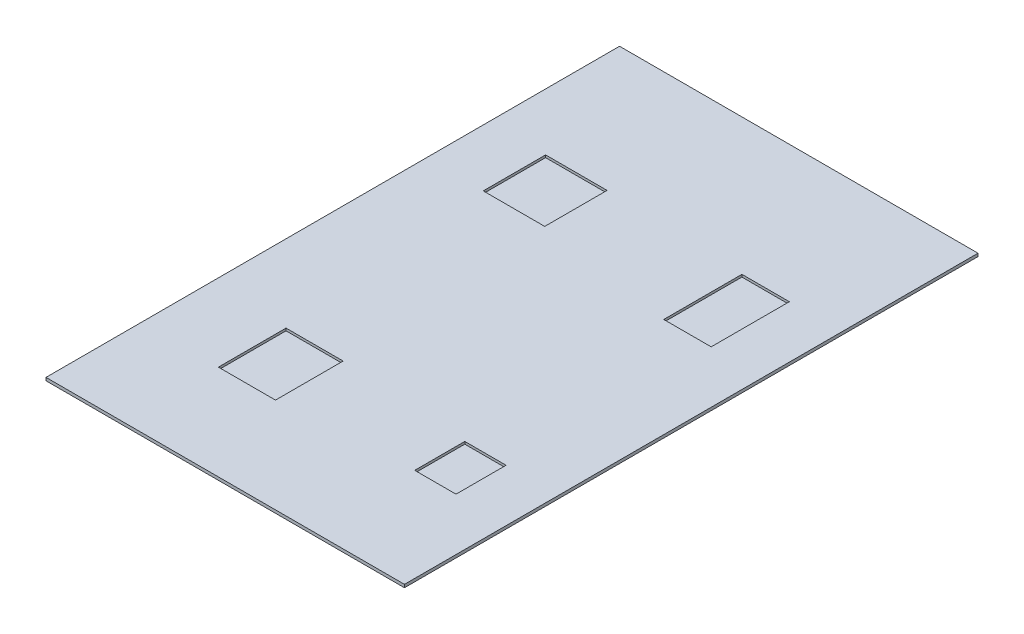
ISO-10303-21;
HEADER;
FILE_DESCRIPTION(('STEP AP214'),'2;1');
FILE_NAME('part.step','',(''),(''),'','','');
FILE_SCHEMA(('AUTOMOTIVE_DESIGN { 1 0 10303 214 1 1 1 1 }'));
ENDSEC;
DATA;
#1=APPLICATION_CONTEXT('core data for automotive mechanical design processes');
#2=APPLICATION_PROTOCOL_DEFINITION('international standard','automotive_design',2000,#1);
#3=PRODUCT_CONTEXT('',#1,'mechanical');
#4=PRODUCT('Part','Part','',(#3));
#5=PRODUCT_RELATED_PRODUCT_CATEGORY('part','',(#4));
#6=PRODUCT_DEFINITION_FORMATION('','',#4);
#7=PRODUCT_DEFINITION_CONTEXT('part definition',#1,'design');
#8=PRODUCT_DEFINITION('design','',#6,#7);
#9=PRODUCT_DEFINITION_SHAPE('','',#8);
#10=(LENGTH_UNIT() NAMED_UNIT(*) SI_UNIT(.MILLI.,.METRE.));
#11=(NAMED_UNIT(*) PLANE_ANGLE_UNIT() SI_UNIT($,.RADIAN.));
#12=(NAMED_UNIT(*) SI_UNIT($,.STERADIAN.) SOLID_ANGLE_UNIT());
#13=UNCERTAINTY_MEASURE_WITH_UNIT(LENGTH_MEASURE(1.E-05),#10,'distance_accuracy_value','');
#14=(GEOMETRIC_REPRESENTATION_CONTEXT(3) GLOBAL_UNCERTAINTY_ASSIGNED_CONTEXT((#13)) GLOBAL_UNIT_ASSIGNED_CONTEXT((#10,
#11,#12)) REPRESENTATION_CONTEXT('',''));
#15=CARTESIAN_POINT('',(0.,0.,0.));
#16=DIRECTION('',(0.,0.,1.));
#17=DIRECTION('',(1.,0.,0.));
#18=AXIS2_PLACEMENT_3D('',#15,#16,#17);
#19=CARTESIAN_POINT('',(190.5,3.175,304.8));
#20=DIRECTION('',(-1.,0.,0.));
#21=DIRECTION('',(0.,0.,1.));
#22=AXIS2_PLACEMENT_3D('',#19,#20,#21);
#23=PLANE('',#22);
#24=DIRECTION('',(0.,0.,-1.));
#25=VECTOR('',#24,1.);
#26=CARTESIAN_POINT('',(190.5,0.,304.8));
#27=LINE('',#26,#25);
#28=CARTESIAN_POINT('',(190.5,0.,304.8));
#29=VERTEX_POINT('',#28);
#30=CARTESIAN_POINT('',(190.5,0.,-304.8));
#31=VERTEX_POINT('',#30);
#32=EDGE_CURVE('E302',#29,#31,#27,.T.);
#33=ORIENTED_EDGE('',*,*,#32,.T.);
#34=DIRECTION('',(0.,-1.,0.));
#35=VECTOR('',#34,1.);
#36=CARTESIAN_POINT('',(190.5,3.175,-304.8));
#37=LINE('',#36,#35);
#38=CARTESIAN_POINT('',(190.5,3.175,-304.8));
#39=VERTEX_POINT('',#38);
#40=EDGE_CURVE('E11',#39,#31,#37,.T.);
#41=ORIENTED_EDGE('',*,*,#40,.F.);
#42=DIRECTION('',(0.,0.,-1.));
#43=VECTOR('',#42,1.);
#44=CARTESIAN_POINT('',(190.5,3.175,304.8));
#45=LINE('',#44,#43);
#46=CARTESIAN_POINT('',(190.5,3.175,304.8));
#47=VERTEX_POINT('',#46);
#48=EDGE_CURVE('E309',#47,#39,#45,.T.);
#49=ORIENTED_EDGE('',*,*,#48,.F.);
#50=DIRECTION('',(0.,-1.,0.));
#51=VECTOR('',#50,1.);
#52=CARTESIAN_POINT('',(190.5,3.175,304.8));
#53=LINE('',#52,#51);
#54=EDGE_CURVE('E319',#47,#29,#53,.T.);
#55=ORIENTED_EDGE('',*,*,#54,.T.);
#56=EDGE_LOOP('',(#33,#41,#49,#55));
#57=FACE_BOUND('',#56,.T.);
#58=ADVANCED_FACE('F41',(#57),#23,.F.);
#59=CARTESIAN_POINT('',(-190.5,3.175,-304.8));
#60=DIRECTION('',(0.,0.,1.));
#61=DIRECTION('',(1.,0.,0.));
#62=AXIS2_PLACEMENT_3D('',#59,#60,#61);
#63=PLANE('',#62);
#64=DIRECTION('',(-1.,0.,0.));
#65=VECTOR('',#64,1.);
#66=CARTESIAN_POINT('',(-190.5,0.,-304.8));
#67=LINE('',#66,#65);
#68=CARTESIAN_POINT('',(-190.5,0.,-304.8));
#69=VERTEX_POINT('',#68);
#70=EDGE_CURVE('E322',#31,#69,#67,.T.);
#71=ORIENTED_EDGE('',*,*,#70,.T.);
#72=DIRECTION('',(0.,-1.,0.));
#73=VECTOR('',#72,1.);
#74=CARTESIAN_POINT('',(-190.5,3.175,-304.8));
#75=LINE('',#74,#73);
#76=CARTESIAN_POINT('',(-190.5,3.175,-304.8));
#77=VERTEX_POINT('',#76);
#78=EDGE_CURVE('E48',#77,#69,#75,.T.);
#79=ORIENTED_EDGE('',*,*,#78,.F.);
#80=DIRECTION('',(-1.,0.,0.));
#81=VECTOR('',#80,1.);
#82=CARTESIAN_POINT('',(-190.5,3.175,-304.8));
#83=LINE('',#82,#81);
#84=EDGE_CURVE('E312',#39,#77,#83,.T.);
#85=ORIENTED_EDGE('',*,*,#84,.F.);
#86=ORIENTED_EDGE('',*,*,#40,.T.);
#87=EDGE_LOOP('',(#71,#79,#85,#86));
#88=FACE_BOUND('',#87,.T.);
#89=ADVANCED_FACE('F351',(#88),#63,.F.);
#90=CARTESIAN_POINT('',(-190.5,3.175,304.8));
#91=DIRECTION('',(1.,0.,0.));
#92=DIRECTION('',(0.,0.,-1.));
#93=AXIS2_PLACEMENT_3D('',#90,#91,#92);
#94=PLANE('',#93);
#95=DIRECTION('',(0.,0.,1.));
#96=VECTOR('',#95,1.);
#97=CARTESIAN_POINT('',(-190.5,0.,304.8));
#98=LINE('',#97,#96);
#99=CARTESIAN_POINT('',(-190.5,0.,304.8));
#100=VERTEX_POINT('',#99);
#101=EDGE_CURVE('E324',#69,#100,#98,.T.);
#102=ORIENTED_EDGE('',*,*,#101,.T.);
#103=DIRECTION('',(0.,-1.,0.));
#104=VECTOR('',#103,1.);
#105=CARTESIAN_POINT('',(-190.5,3.175,304.8));
#106=LINE('',#105,#104);
#107=CARTESIAN_POINT('',(-190.5,3.175,304.8));
#108=VERTEX_POINT('',#107);
#109=EDGE_CURVE('E329',#108,#100,#106,.T.);
#110=ORIENTED_EDGE('',*,*,#109,.F.);
#111=DIRECTION('',(0.,0.,1.));
#112=VECTOR('',#111,1.);
#113=CARTESIAN_POINT('',(-190.5,3.175,304.8));
#114=LINE('',#113,#112);
#115=EDGE_CURVE('E315',#77,#108,#114,.T.);
#116=ORIENTED_EDGE('',*,*,#115,.F.);
#117=ORIENTED_EDGE('',*,*,#78,.T.);
#118=EDGE_LOOP('',(#102,#110,#116,#117));
#119=FACE_BOUND('',#118,.T.);
#120=ADVANCED_FACE('F336',(#119),#94,.F.);
#121=CARTESIAN_POINT('',(-190.5,3.175,304.8));
#122=DIRECTION('',(0.,0.,-1.));
#123=DIRECTION('',(-1.,0.,0.));
#124=AXIS2_PLACEMENT_3D('',#121,#122,#123);
#125=PLANE('',#124);
#126=DIRECTION('',(1.,0.,0.));
#127=VECTOR('',#126,1.);
#128=CARTESIAN_POINT('',(-190.5,0.,304.8));
#129=LINE('',#128,#127);
#130=EDGE_CURVE('E313',#100,#29,#129,.T.);
#131=ORIENTED_EDGE('',*,*,#130,.T.);
#132=ORIENTED_EDGE('',*,*,#54,.F.);
#133=DIRECTION('',(1.,0.,0.));
#134=VECTOR('',#133,1.);
#135=CARTESIAN_POINT('',(-190.5,3.175,304.8));
#136=LINE('',#135,#134);
#137=EDGE_CURVE('E317',#108,#47,#136,.T.);
#138=ORIENTED_EDGE('',*,*,#137,.F.);
#139=ORIENTED_EDGE('',*,*,#109,.T.);
#140=EDGE_LOOP('',(#131,#132,#138,#139));
#141=FACE_BOUND('',#140,.T.);
#142=ADVANCED_FACE('F345',(#141),#125,.F.);
#143=CARTESIAN_POINT('',(0.,3.175,0.));
#144=DIRECTION('',(0.,-1.,0.));
#145=DIRECTION('',(0.,0.,-1.));
#146=AXIS2_PLACEMENT_3D('',#143,#144,#145);
#147=PLANE('',#146);
#148=DIRECTION('',(-1.,0.,0.));
#149=VECTOR('',#148,1.);
#150=CARTESIAN_POINT('',(84.4921662468006,3.175,-159.881585301266));
#151=LINE('',#150,#149);
#152=CARTESIAN_POINT('',(134.907381465886,3.175,-159.881585301266));
#153=VERTEX_POINT('',#152);
#154=CARTESIAN_POINT('',(84.4921662468006,3.175,-159.881585301266));
#155=VERTEX_POINT('',#154);
#156=EDGE_CURVE('E235',#153,#155,#151,.T.);
#157=ORIENTED_EDGE('',*,*,#156,.F.);
#158=DIRECTION('',(0.,0.,-1.));
#159=VECTOR('',#158,1.);
#160=CARTESIAN_POINT('',(134.907381465886,3.175,-76.7898416994404));
#161=LINE('',#160,#159);
#162=CARTESIAN_POINT('',(134.907381465886,3.175,-76.7898416994404));
#163=VERTEX_POINT('',#162);
#164=EDGE_CURVE('E55',#163,#153,#161,.T.);
#165=ORIENTED_EDGE('',*,*,#164,.F.);
#166=DIRECTION('',(1.,0.,0.));
#167=VECTOR('',#166,1.);
#168=CARTESIAN_POINT('',(84.4921662468006,3.175,-76.7898416994404));
#169=LINE('',#168,#167);
#170=CARTESIAN_POINT('',(84.4921662468006,3.175,-76.7898416994404));
#171=VERTEX_POINT('',#170);
#172=EDGE_CURVE('E228',#171,#163,#169,.T.);
#173=ORIENTED_EDGE('',*,*,#172,.F.);
#174=DIRECTION('',(0.,0.,1.));
#175=VECTOR('',#174,1.);
#176=CARTESIAN_POINT('',(84.4921662468006,3.175,-76.7898416994404));
#177=LINE('',#176,#175);
#178=EDGE_CURVE('E231',#155,#171,#177,.T.);
#179=ORIENTED_EDGE('',*,*,#178,.F.);
#180=EDGE_LOOP('',(#157,#165,#173,#179));
#181=FACE_BOUND('',#180,.T.);
#182=DIRECTION('',(-1.,0.,0.));
#183=VECTOR('',#182,1.);
#184=CARTESIAN_POINT('',(-108.299351211369,3.175,131.873132401775));
#185=LINE('',#184,#183);
#186=CARTESIAN_POINT('',(-47.6143699291363,3.175,131.873132401775));
#187=VERTEX_POINT('',#186);
#188=CARTESIAN_POINT('',(-108.299351211369,3.175,131.873132401775));
#189=VERTEX_POINT('',#188);
#190=EDGE_CURVE('E263',#187,#189,#185,.T.);
#191=ORIENTED_EDGE('',*,*,#190,.F.);
#192=DIRECTION('',(0.,0.,-1.));
#193=VECTOR('',#192,1.);
#194=CARTESIAN_POINT('',(-47.6143699291363,3.175,203.761494843804));
#195=LINE('',#194,#193);
#196=CARTESIAN_POINT('',(-47.6143699291363,3.175,203.761494843804));
#197=VERTEX_POINT('',#196);
#198=EDGE_CURVE('E63',#197,#187,#195,.T.);
#199=ORIENTED_EDGE('',*,*,#198,.F.);
#200=DIRECTION('',(1.,0.,0.));
#201=VECTOR('',#200,1.);
#202=CARTESIAN_POINT('',(-108.299351211369,3.175,203.761494843804));
#203=LINE('',#202,#201);
#204=CARTESIAN_POINT('',(-108.299351211369,3.175,203.761494843804));
#205=VERTEX_POINT('',#204);
#206=EDGE_CURVE('E256',#205,#197,#203,.T.);
#207=ORIENTED_EDGE('',*,*,#206,.F.);
#208=DIRECTION('',(0.,0.,1.));
#209=VECTOR('',#208,1.);
#210=CARTESIAN_POINT('',(-108.299351211369,3.175,203.761494843804));
#211=LINE('',#210,#209);
#212=EDGE_CURVE('E259',#189,#205,#211,.T.);
#213=ORIENTED_EDGE('',*,*,#212,.F.);
#214=EDGE_LOOP('',(#191,#199,#207,#213));
#215=FACE_BOUND('',#214,.T.);
#216=DIRECTION('',(-1.,0.,0.));
#217=VECTOR('',#216,1.);
#218=CARTESIAN_POINT('',(91.0274719233488,3.175,141.209283368272));
#219=LINE('',#218,#217);
#220=CARTESIAN_POINT('',(134.907381465886,3.175,141.209283368272));
#221=VERTEX_POINT('',#220);
#222=CARTESIAN_POINT('',(91.0274719233488,3.175,141.209283368272));
#223=VERTEX_POINT('',#222);
#224=EDGE_CURVE('E201',#221,#223,#219,.T.);
#225=ORIENTED_EDGE('',*,*,#224,.F.);
#226=DIRECTION('',(0.,0.,-1.));
#227=VECTOR('',#226,1.);
#228=CARTESIAN_POINT('',(134.907381465886,3.175,194.425343877306));
#229=LINE('',#228,#227);
#230=CARTESIAN_POINT('',(134.907381465886,3.175,194.425343877306));
#231=VERTEX_POINT('',#230);
#232=EDGE_CURVE('E180',#231,#221,#229,.T.);
#233=ORIENTED_EDGE('',*,*,#232,.F.);
#234=DIRECTION('',(1.,0.,0.));
#235=VECTOR('',#234,1.);
#236=CARTESIAN_POINT('',(91.0274719233488,3.175,194.425343877306));
#237=LINE('',#236,#235);
#238=CARTESIAN_POINT('',(91.0274719233488,3.175,194.425343877306));
#239=VERTEX_POINT('',#238);
#240=EDGE_CURVE('E190',#239,#231,#237,.T.);
#241=ORIENTED_EDGE('',*,*,#240,.F.);
#242=DIRECTION('',(0.,0.,1.));
#243=VECTOR('',#242,1.);
#244=CARTESIAN_POINT('',(91.0274719233488,3.175,194.425343877306));
#245=LINE('',#244,#243);
#246=EDGE_CURVE('E195',#223,#239,#245,.T.);
#247=ORIENTED_EDGE('',*,*,#246,.F.);
#248=EDGE_LOOP('',(#225,#233,#241,#247));
#249=FACE_BOUND('',#248,.T.);
#250=DIRECTION('',(-1.,0.,0.));
#251=VECTOR('',#250,1.);
#252=CARTESIAN_POINT('',(-129.772498434313,3.175,-165.483275881165));
#253=LINE('',#252,#251);
#254=CARTESIAN_POINT('',(-64.4194416688314,3.175,-165.483275881165));
#255=VERTEX_POINT('',#254);
#256=CARTESIAN_POINT('',(-129.772498434313,3.175,-165.483275881165));
#257=VERTEX_POINT('',#256);
#258=EDGE_CURVE('E292',#255,#257,#253,.T.);
#259=ORIENTED_EDGE('',*,*,#258,.F.);
#260=DIRECTION('',(0.,0.,-1.));
#261=VECTOR('',#260,1.);
#262=CARTESIAN_POINT('',(-64.4194416688314,3.175,-99.1966040190339));
#263=LINE('',#262,#261);
#264=CARTESIAN_POINT('',(-64.4194416688314,3.175,-99.1966040190339));
#265=VERTEX_POINT('',#264);
#266=EDGE_CURVE('E239',#265,#255,#263,.T.);
#267=ORIENTED_EDGE('',*,*,#266,.F.);
#268=DIRECTION('',(1.,0.,0.));
#269=VECTOR('',#268,1.);
#270=CARTESIAN_POINT('',(-129.772498434313,3.175,-99.1966040190339));
#271=LINE('',#270,#269);
#272=CARTESIAN_POINT('',(-129.772498434313,3.175,-99.1966040190339));
#273=VERTEX_POINT('',#272);
#274=EDGE_CURVE('E281',#273,#265,#271,.T.);
#275=ORIENTED_EDGE('',*,*,#274,.F.);
#276=DIRECTION('',(0.,0.,1.));
#277=VECTOR('',#276,1.);
#278=CARTESIAN_POINT('',(-129.772498434313,3.175,-99.1966040190339));
#279=LINE('',#278,#277);
#280=EDGE_CURVE('E295',#257,#273,#279,.T.);
#281=ORIENTED_EDGE('',*,*,#280,.F.);
#282=EDGE_LOOP('',(#259,#267,#275,#281));
#283=FACE_BOUND('',#282,.T.);
#284=ORIENTED_EDGE('',*,*,#48,.T.);
#285=ORIENTED_EDGE('',*,*,#84,.T.);
#286=ORIENTED_EDGE('',*,*,#115,.T.);
#287=ORIENTED_EDGE('',*,*,#137,.T.);
#288=EDGE_LOOP('',(#284,#285,#286,#287));
#289=FACE_BOUND('',#288,.T.);
#290=ADVANCED_FACE('F198',(#181,#215,#249,#283,#289),#147,.F.);
#291=CARTESIAN_POINT('',(0.,0.,0.));
#292=DIRECTION('',(0.,-1.,0.));
#293=DIRECTION('',(0.,0.,-1.));
#294=AXIS2_PLACEMENT_3D('',#291,#292,#293);
#295=PLANE('',#294);
#296=ORIENTED_EDGE('',*,*,#32,.F.);
#297=ORIENTED_EDGE('',*,*,#130,.F.);
#298=ORIENTED_EDGE('',*,*,#101,.F.);
#299=ORIENTED_EDGE('',*,*,#70,.F.);
#300=EDGE_LOOP('',(#296,#297,#298,#299));
#301=FACE_BOUND('',#300,.T.);
#302=ADVANCED_FACE('F342',(#301),#295,.T.);
#303=CARTESIAN_POINT('',(-64.4194416688314,0.635,-99.1966040190339));
#304=DIRECTION('',(1.,0.,0.));
#305=DIRECTION('',(0.,0.,-1.));
#306=AXIS2_PLACEMENT_3D('',#303,#304,#305);
#307=PLANE('',#306);
#308=ORIENTED_EDGE('',*,*,#266,.T.);
#309=DIRECTION('',(0.,1.,0.));
#310=VECTOR('',#309,1.);
#311=CARTESIAN_POINT('',(-64.4194416688314,0.635,-165.483275881165));
#312=LINE('',#311,#310);
#313=CARTESIAN_POINT('',(-64.4194416688314,0.635,-165.483275881165));
#314=VERTEX_POINT('',#313);
#315=EDGE_CURVE('E290',#314,#255,#312,.T.);
#316=ORIENTED_EDGE('',*,*,#315,.F.);
#317=DIRECTION('',(0.,0.,-1.));
#318=VECTOR('',#317,1.);
#319=CARTESIAN_POINT('',(-64.4194416688314,0.635,-99.1966040190339));
#320=LINE('',#319,#318);
#321=CARTESIAN_POINT('',(-64.4194416688314,0.635,-99.1966040190339));
#322=VERTEX_POINT('',#321);
#323=EDGE_CURVE('E277',#322,#314,#320,.T.);
#324=ORIENTED_EDGE('',*,*,#323,.F.);
#325=DIRECTION('',(0.,1.,0.));
#326=VECTOR('',#325,1.);
#327=CARTESIAN_POINT('',(-64.4194416688314,0.635,-99.1966040190339));
#328=LINE('',#327,#326);
#329=EDGE_CURVE('E300',#322,#265,#328,.T.);
#330=ORIENTED_EDGE('',*,*,#329,.T.);
#331=EDGE_LOOP('',(#308,#316,#324,#330));
#332=FACE_BOUND('',#331,.T.);
#333=ADVANCED_FACE('F363',(#332),#307,.F.);
#334=CARTESIAN_POINT('',(-129.772498434313,0.635,-99.1966040190339));
#335=DIRECTION('',(0.,0.,1.));
#336=DIRECTION('',(1.,0.,0.));
#337=AXIS2_PLACEMENT_3D('',#334,#335,#336);
#338=PLANE('',#337);
#339=ORIENTED_EDGE('',*,*,#274,.T.);
#340=ORIENTED_EDGE('',*,*,#329,.F.);
#341=DIRECTION('',(1.,0.,0.));
#342=VECTOR('',#341,1.);
#343=CARTESIAN_POINT('',(-129.772498434313,0.635,-99.1966040190339));
#344=LINE('',#343,#342);
#345=CARTESIAN_POINT('',(-129.772498434313,0.635,-99.1966040190339));
#346=VERTEX_POINT('',#345);
#347=EDGE_CURVE('E287',#346,#322,#344,.T.);
#348=ORIENTED_EDGE('',*,*,#347,.F.);
#349=DIRECTION('',(0.,1.,0.));
#350=VECTOR('',#349,1.);
#351=CARTESIAN_POINT('',(-129.772498434313,0.635,-99.1966040190339));
#352=LINE('',#351,#350);
#353=EDGE_CURVE('E303',#346,#273,#352,.T.);
#354=ORIENTED_EDGE('',*,*,#353,.T.);
#355=EDGE_LOOP('',(#339,#340,#348,#354));
#356=FACE_BOUND('',#355,.T.);
#357=ADVANCED_FACE('F369',(#356),#338,.F.);
#358=CARTESIAN_POINT('',(-129.772498434313,0.635,-99.1966040190339));
#359=DIRECTION('',(-1.,0.,0.));
#360=DIRECTION('',(0.,0.,1.));
#361=AXIS2_PLACEMENT_3D('',#358,#359,#360);
#362=PLANE('',#361);
#363=ORIENTED_EDGE('',*,*,#280,.T.);
#364=ORIENTED_EDGE('',*,*,#353,.F.);
#365=DIRECTION('',(0.,0.,1.));
#366=VECTOR('',#365,1.);
#367=CARTESIAN_POINT('',(-129.772498434313,0.635,-99.1966040190339));
#368=LINE('',#367,#366);
#369=CARTESIAN_POINT('',(-129.772498434313,0.635,-165.483275881165));
#370=VERTEX_POINT('',#369);
#371=EDGE_CURVE('E284',#370,#346,#368,.T.);
#372=ORIENTED_EDGE('',*,*,#371,.F.);
#373=DIRECTION('',(0.,1.,0.));
#374=VECTOR('',#373,1.);
#375=CARTESIAN_POINT('',(-129.772498434313,0.635,-165.483275881165));
#376=LINE('',#375,#374);
#377=EDGE_CURVE('E305',#370,#257,#376,.T.);
#378=ORIENTED_EDGE('',*,*,#377,.T.);
#379=EDGE_LOOP('',(#363,#364,#372,#378));
#380=FACE_BOUND('',#379,.T.);
#381=ADVANCED_FACE('F375',(#380),#362,.F.);
#382=CARTESIAN_POINT('',(-129.772498434313,0.635,-165.483275881165));
#383=DIRECTION('',(0.,0.,-1.));
#384=DIRECTION('',(-1.,0.,0.));
#385=AXIS2_PLACEMENT_3D('',#382,#383,#384);
#386=PLANE('',#385);
#387=ORIENTED_EDGE('',*,*,#258,.T.);
#388=ORIENTED_EDGE('',*,*,#377,.F.);
#389=DIRECTION('',(-1.,0.,0.));
#390=VECTOR('',#389,1.);
#391=CARTESIAN_POINT('',(-129.772498434313,0.635,-165.483275881165));
#392=LINE('',#391,#390);
#393=EDGE_CURVE('E280',#314,#370,#392,.T.);
#394=ORIENTED_EDGE('',*,*,#393,.F.);
#395=ORIENTED_EDGE('',*,*,#315,.T.);
#396=EDGE_LOOP('',(#387,#388,#394,#395));
#397=FACE_BOUND('',#396,.T.);
#398=ADVANCED_FACE('F371',(#397),#386,.F.);
#399=CARTESIAN_POINT('',(0.,0.635,0.));
#400=DIRECTION('',(0.,-1.,0.));
#401=DIRECTION('',(0.,0.,-1.));
#402=AXIS2_PLACEMENT_3D('',#399,#400,#401);
#403=PLANE('',#402);
#404=ORIENTED_EDGE('',*,*,#323,.T.);
#405=ORIENTED_EDGE('',*,*,#393,.T.);
#406=ORIENTED_EDGE('',*,*,#371,.T.);
#407=ORIENTED_EDGE('',*,*,#347,.T.);
#408=EDGE_LOOP('',(#404,#405,#406,#407));
#409=FACE_BOUND('',#408,.T.);
#410=ADVANCED_FACE('F374',(#409),#403,.F.);
#411=CARTESIAN_POINT('',(134.907381465886,0.635,194.425343877306));
#412=DIRECTION('',(1.,0.,0.));
#413=DIRECTION('',(0.,0.,-1.));
#414=AXIS2_PLACEMENT_3D('',#411,#412,#413);
#415=PLANE('',#414);
#416=ORIENTED_EDGE('',*,*,#232,.T.);
#417=DIRECTION('',(0.,1.,0.));
#418=VECTOR('',#417,1.);
#419=CARTESIAN_POINT('',(134.907381465886,0.635,141.209283368272));
#420=LINE('',#419,#418);
#421=CARTESIAN_POINT('',(134.907381465886,0.635,141.209283368272));
#422=VERTEX_POINT('',#421);
#423=EDGE_CURVE('E212',#422,#221,#420,.T.);
#424=ORIENTED_EDGE('',*,*,#423,.F.);
#425=DIRECTION('',(0.,0.,-1.));
#426=VECTOR('',#425,1.);
#427=CARTESIAN_POINT('',(134.907381465886,0.635,194.425343877306));
#428=LINE('',#427,#426);
#429=CARTESIAN_POINT('',(134.907381465886,0.635,194.425343877306));
#430=VERTEX_POINT('',#429);
#431=EDGE_CURVE('E183',#430,#422,#428,.T.);
#432=ORIENTED_EDGE('',*,*,#431,.F.);
#433=DIRECTION('',(0.,1.,0.));
#434=VECTOR('',#433,1.);
#435=CARTESIAN_POINT('',(134.907381465886,0.635,194.425343877306));
#436=LINE('',#435,#434);
#437=EDGE_CURVE('E176',#430,#231,#436,.T.);
#438=ORIENTED_EDGE('',*,*,#437,.T.);
#439=EDGE_LOOP('',(#416,#424,#432,#438));
#440=FACE_BOUND('',#439,.T.);
#441=ADVANCED_FACE('F178',(#440),#415,.F.);
#442=CARTESIAN_POINT('',(91.0274719233488,0.635,194.425343877306));
#443=DIRECTION('',(0.,0.,1.));
#444=DIRECTION('',(1.,0.,0.));
#445=AXIS2_PLACEMENT_3D('',#442,#443,#444);
#446=PLANE('',#445);
#447=ORIENTED_EDGE('',*,*,#240,.T.);
#448=ORIENTED_EDGE('',*,*,#437,.F.);
#449=DIRECTION('',(1.,0.,0.));
#450=VECTOR('',#449,1.);
#451=CARTESIAN_POINT('',(91.0274719233488,0.635,194.425343877306));
#452=LINE('',#451,#450);
#453=CARTESIAN_POINT('',(91.0274719233488,0.635,194.425343877306));
#454=VERTEX_POINT('',#453);
#455=EDGE_CURVE('E209',#454,#430,#452,.T.);
#456=ORIENTED_EDGE('',*,*,#455,.F.);
#457=DIRECTION('',(0.,1.,0.));
#458=VECTOR('',#457,1.);
#459=CARTESIAN_POINT('',(91.0274719233488,0.635,194.425343877306));
#460=LINE('',#459,#458);
#461=EDGE_CURVE('E187',#454,#239,#460,.T.);
#462=ORIENTED_EDGE('',*,*,#461,.T.);
#463=EDGE_LOOP('',(#447,#448,#456,#462));
#464=FACE_BOUND('',#463,.T.);
#465=ADVANCED_FACE('F191',(#464),#446,.F.);
#466=CARTESIAN_POINT('',(91.0274719233488,0.635,194.425343877306));
#467=DIRECTION('',(-1.,0.,0.));
#468=DIRECTION('',(0.,0.,1.));
#469=AXIS2_PLACEMENT_3D('',#466,#467,#468);
#470=PLANE('',#469);
#471=ORIENTED_EDGE('',*,*,#246,.T.);
#472=ORIENTED_EDGE('',*,*,#461,.F.);
#473=DIRECTION('',(0.,0.,1.));
#474=VECTOR('',#473,1.);
#475=CARTESIAN_POINT('',(91.0274719233488,0.635,194.425343877306));
#476=LINE('',#475,#474);
#477=CARTESIAN_POINT('',(91.0274719233488,0.635,141.209283368272));
#478=VERTEX_POINT('',#477);
#479=EDGE_CURVE('E211',#478,#454,#476,.T.);
#480=ORIENTED_EDGE('',*,*,#479,.F.);
#481=DIRECTION('',(0.,1.,0.));
#482=VECTOR('',#481,1.);
#483=CARTESIAN_POINT('',(91.0274719233488,0.635,141.209283368272));
#484=LINE('',#483,#482);
#485=EDGE_CURVE('E596',#478,#223,#484,.T.);
#486=ORIENTED_EDGE('',*,*,#485,.T.);
#487=EDGE_LOOP('',(#471,#472,#480,#486));
#488=FACE_BOUND('',#487,.T.);
#489=ADVANCED_FACE('F431',(#488),#470,.F.);
#490=CARTESIAN_POINT('',(91.0274719233488,0.635,141.209283368272));
#491=DIRECTION('',(0.,0.,-1.));
#492=DIRECTION('',(-1.,0.,0.));
#493=AXIS2_PLACEMENT_3D('',#490,#491,#492);
#494=PLANE('',#493);
#495=ORIENTED_EDGE('',*,*,#224,.T.);
#496=ORIENTED_EDGE('',*,*,#485,.F.);
#497=DIRECTION('',(-1.,0.,0.));
#498=VECTOR('',#497,1.);
#499=CARTESIAN_POINT('',(91.0274719233488,0.635,141.209283368272));
#500=LINE('',#499,#498);
#501=EDGE_CURVE('E215',#422,#478,#500,.T.);
#502=ORIENTED_EDGE('',*,*,#501,.F.);
#503=ORIENTED_EDGE('',*,*,#423,.T.);
#504=EDGE_LOOP('',(#495,#496,#502,#503));
#505=FACE_BOUND('',#504,.T.);
#506=ADVANCED_FACE('F427',(#505),#494,.F.);
#507=CARTESIAN_POINT('',(0.,0.635,0.));
#508=DIRECTION('',(0.,-1.,0.));
#509=DIRECTION('',(0.,0.,-1.));
#510=AXIS2_PLACEMENT_3D('',#507,#508,#509);
#511=PLANE('',#510);
#512=ORIENTED_EDGE('',*,*,#431,.T.);
#513=ORIENTED_EDGE('',*,*,#501,.T.);
#514=ORIENTED_EDGE('',*,*,#479,.T.);
#515=ORIENTED_EDGE('',*,*,#455,.T.);
#516=EDGE_LOOP('',(#512,#513,#514,#515));
#517=FACE_BOUND('',#516,.T.);
#518=ADVANCED_FACE('F406',(#517),#511,.F.);
#519=CARTESIAN_POINT('',(-47.6143699291363,0.635,203.761494843804));
#520=DIRECTION('',(1.,0.,0.));
#521=DIRECTION('',(0.,0.,-1.));
#522=AXIS2_PLACEMENT_3D('',#519,#520,#521);
#523=PLANE('',#522);
#524=ORIENTED_EDGE('',*,*,#198,.T.);
#525=DIRECTION('',(0.,1.,0.));
#526=VECTOR('',#525,1.);
#527=CARTESIAN_POINT('',(-47.6143699291363,0.635,131.873132401775));
#528=LINE('',#527,#526);
#529=CARTESIAN_POINT('',(-47.6143699291363,0.635,131.873132401775));
#530=VERTEX_POINT('',#529);
#531=EDGE_CURVE('E250',#530,#187,#528,.T.);
#532=ORIENTED_EDGE('',*,*,#531,.F.);
#533=DIRECTION('',(0.,0.,-1.));
#534=VECTOR('',#533,1.);
#535=CARTESIAN_POINT('',(-47.6143699291363,0.635,203.761494843804));
#536=LINE('',#535,#534);
#537=CARTESIAN_POINT('',(-47.6143699291363,0.635,203.761494843804));
#538=VERTEX_POINT('',#537);
#539=EDGE_CURVE('E260',#538,#530,#536,.T.);
#540=ORIENTED_EDGE('',*,*,#539,.F.);
#541=DIRECTION('',(0.,1.,0.));
#542=VECTOR('',#541,1.);
#543=CARTESIAN_POINT('',(-47.6143699291363,0.635,203.761494843804));
#544=LINE('',#543,#542);
#545=EDGE_CURVE('E202',#538,#197,#544,.T.);
#546=ORIENTED_EDGE('',*,*,#545,.T.);
#547=EDGE_LOOP('',(#524,#532,#540,#546));
#548=FACE_BOUND('',#547,.T.);
#549=ADVANCED_FACE('F396',(#548),#523,.F.);
#550=CARTESIAN_POINT('',(-108.299351211369,0.635,203.761494843804));
#551=DIRECTION('',(0.,0.,1.));
#552=DIRECTION('',(1.,0.,0.));
#553=AXIS2_PLACEMENT_3D('',#550,#551,#552);
#554=PLANE('',#553);
#555=ORIENTED_EDGE('',*,*,#206,.T.);
#556=ORIENTED_EDGE('',*,*,#545,.F.);
#557=DIRECTION('',(1.,0.,0.));
#558=VECTOR('',#557,1.);
#559=CARTESIAN_POINT('',(-108.299351211369,0.635,203.761494843804));
#560=LINE('',#559,#558);
#561=CARTESIAN_POINT('',(-108.299351211369,0.635,203.761494843804));
#562=VERTEX_POINT('',#561);
#563=EDGE_CURVE('E252',#562,#538,#560,.T.);
#564=ORIENTED_EDGE('',*,*,#563,.F.);
#565=DIRECTION('',(0.,1.,0.));
#566=VECTOR('',#565,1.);
#567=CARTESIAN_POINT('',(-108.299351211369,0.635,203.761494843804));
#568=LINE('',#567,#566);
#569=EDGE_CURVE('E204',#562,#205,#568,.T.);
#570=ORIENTED_EDGE('',*,*,#569,.T.);
#571=EDGE_LOOP('',(#555,#556,#564,#570));
#572=FACE_BOUND('',#571,.T.);
#573=ADVANCED_FACE('F392',(#572),#554,.F.);
#574=CARTESIAN_POINT('',(-108.299351211369,0.635,203.761494843804));
#575=DIRECTION('',(-1.,0.,0.));
#576=DIRECTION('',(0.,0.,1.));
#577=AXIS2_PLACEMENT_3D('',#574,#575,#576);
#578=PLANE('',#577);
#579=ORIENTED_EDGE('',*,*,#212,.T.);
#580=ORIENTED_EDGE('',*,*,#569,.F.);
#581=DIRECTION('',(0.,0.,1.));
#582=VECTOR('',#581,1.);
#583=CARTESIAN_POINT('',(-108.299351211369,0.635,203.761494843804));
#584=LINE('',#583,#582);
#585=CARTESIAN_POINT('',(-108.299351211369,0.635,131.873132401775));
#586=VERTEX_POINT('',#585);
#587=EDGE_CURVE('E269',#586,#562,#584,.T.);
#588=ORIENTED_EDGE('',*,*,#587,.F.);
#589=DIRECTION('',(0.,1.,0.));
#590=VECTOR('',#589,1.);
#591=CARTESIAN_POINT('',(-108.299351211369,0.635,131.873132401775));
#592=LINE('',#591,#590);
#593=EDGE_CURVE('E253',#586,#189,#592,.T.);
#594=ORIENTED_EDGE('',*,*,#593,.T.);
#595=EDGE_LOOP('',(#579,#580,#588,#594));
#596=FACE_BOUND('',#595,.T.);
#597=ADVANCED_FACE('F395',(#596),#578,.F.);
#598=CARTESIAN_POINT('',(-108.299351211369,0.635,131.873132401775));
#599=DIRECTION('',(0.,0.,-1.));
#600=DIRECTION('',(-1.,0.,0.));
#601=AXIS2_PLACEMENT_3D('',#598,#599,#600);
#602=PLANE('',#601);
#603=ORIENTED_EDGE('',*,*,#190,.T.);
#604=ORIENTED_EDGE('',*,*,#593,.F.);
#605=DIRECTION('',(-1.,0.,0.));
#606=VECTOR('',#605,1.);
#607=CARTESIAN_POINT('',(-108.299351211369,0.635,131.873132401775));
#608=LINE('',#607,#606);
#609=EDGE_CURVE('E272',#530,#586,#608,.T.);
#610=ORIENTED_EDGE('',*,*,#609,.F.);
#611=ORIENTED_EDGE('',*,*,#531,.T.);
#612=EDGE_LOOP('',(#603,#604,#610,#611));
#613=FACE_BOUND('',#612,.T.);
#614=ADVANCED_FACE('F390',(#613),#602,.F.);
#615=CARTESIAN_POINT('',(0.,0.635,0.));
#616=DIRECTION('',(0.,-1.,0.));
#617=DIRECTION('',(0.,0.,-1.));
#618=AXIS2_PLACEMENT_3D('',#615,#616,#617);
#619=PLANE('',#618);
#620=ORIENTED_EDGE('',*,*,#539,.T.);
#621=ORIENTED_EDGE('',*,*,#609,.T.);
#622=ORIENTED_EDGE('',*,*,#587,.T.);
#623=ORIENTED_EDGE('',*,*,#563,.T.);
#624=EDGE_LOOP('',(#620,#621,#622,#623));
#625=FACE_BOUND('',#624,.T.);
#626=ADVANCED_FACE('F386',(#625),#619,.F.);
#627=CARTESIAN_POINT('',(134.907381465886,0.635,-76.7898416994404));
#628=DIRECTION('',(1.,0.,0.));
#629=DIRECTION('',(0.,0.,-1.));
#630=AXIS2_PLACEMENT_3D('',#627,#628,#629);
#631=PLANE('',#630);
#632=ORIENTED_EDGE('',*,*,#164,.T.);
#633=DIRECTION('',(0.,1.,0.));
#634=VECTOR('',#633,1.);
#635=CARTESIAN_POINT('',(134.907381465886,0.635,-159.881585301266));
#636=LINE('',#635,#634);
#637=CARTESIAN_POINT('',(134.907381465886,0.635,-159.881585301266));
#638=VERTEX_POINT('',#637);
#639=EDGE_CURVE('E219',#638,#153,#636,.T.);
#640=ORIENTED_EDGE('',*,*,#639,.F.);
#641=DIRECTION('',(0.,0.,-1.));
#642=VECTOR('',#641,1.);
#643=CARTESIAN_POINT('',(134.907381465886,0.635,-76.7898416994404));
#644=LINE('',#643,#642);
#645=CARTESIAN_POINT('',(134.907381465886,0.635,-76.7898416994404));
#646=VERTEX_POINT('',#645);
#647=EDGE_CURVE('E232',#646,#638,#644,.T.);
#648=ORIENTED_EDGE('',*,*,#647,.F.);
#649=DIRECTION('',(0.,1.,0.));
#650=VECTOR('',#649,1.);
#651=CARTESIAN_POINT('',(134.907381465886,0.635,-76.7898416994404));
#652=LINE('',#651,#650);
#653=EDGE_CURVE('E226',#646,#163,#652,.T.);
#654=ORIENTED_EDGE('',*,*,#653,.T.);
#655=EDGE_LOOP('',(#632,#640,#648,#654));
#656=FACE_BOUND('',#655,.T.);
#657=ADVANCED_FACE('F389',(#656),#631,.F.);
#658=CARTESIAN_POINT('',(84.4921662468006,0.635,-76.7898416994404));
#659=DIRECTION('',(0.,0.,1.));
#660=DIRECTION('',(1.,0.,0.));
#661=AXIS2_PLACEMENT_3D('',#658,#659,#660);
#662=PLANE('',#661);
#663=ORIENTED_EDGE('',*,*,#172,.T.);
#664=ORIENTED_EDGE('',*,*,#653,.F.);
#665=DIRECTION('',(1.,0.,0.));
#666=VECTOR('',#665,1.);
#667=CARTESIAN_POINT('',(84.4921662468006,0.635,-76.7898416994404));
#668=LINE('',#667,#666);
#669=CARTESIAN_POINT('',(84.4921662468006,0.635,-76.7898416994404));
#670=VERTEX_POINT('',#669);
#671=EDGE_CURVE('E221',#670,#646,#668,.T.);
#672=ORIENTED_EDGE('',*,*,#671,.F.);
#673=DIRECTION('',(0.,1.,0.));
#674=VECTOR('',#673,1.);
#675=CARTESIAN_POINT('',(84.4921662468006,0.635,-76.7898416994404));
#676=LINE('',#675,#674);
#677=EDGE_CURVE('E224',#670,#171,#676,.T.);
#678=ORIENTED_EDGE('',*,*,#677,.T.);
#679=EDGE_LOOP('',(#663,#664,#672,#678));
#680=FACE_BOUND('',#679,.T.);
#681=ADVANCED_FACE('F412',(#680),#662,.F.);
#682=CARTESIAN_POINT('',(84.4921662468006,0.635,-76.7898416994404));
#683=DIRECTION('',(-1.,0.,0.));
#684=DIRECTION('',(0.,0.,1.));
#685=AXIS2_PLACEMENT_3D('',#682,#683,#684);
#686=PLANE('',#685);
#687=ORIENTED_EDGE('',*,*,#178,.T.);
#688=ORIENTED_EDGE('',*,*,#677,.F.);
#689=DIRECTION('',(0.,0.,1.));
#690=VECTOR('',#689,1.);
#691=CARTESIAN_POINT('',(84.4921662468006,0.635,-76.7898416994404));
#692=LINE('',#691,#690);
#693=CARTESIAN_POINT('',(84.4921662468006,0.635,-159.881585301266));
#694=VERTEX_POINT('',#693);
#695=EDGE_CURVE('E242',#694,#670,#692,.T.);
#696=ORIENTED_EDGE('',*,*,#695,.F.);
#697=DIRECTION('',(0.,1.,0.));
#698=VECTOR('',#697,1.);
#699=CARTESIAN_POINT('',(84.4921662468006,0.635,-159.881585301266));
#700=LINE('',#699,#698);
#701=EDGE_CURVE('E222',#694,#155,#700,.T.);
#702=ORIENTED_EDGE('',*,*,#701,.T.);
#703=EDGE_LOOP('',(#687,#688,#696,#702));
#704=FACE_BOUND('',#703,.T.);
#705=ADVANCED_FACE('F415',(#704),#686,.F.);
#706=CARTESIAN_POINT('',(84.4921662468006,0.635,-159.881585301266));
#707=DIRECTION('',(0.,0.,-1.));
#708=DIRECTION('',(-1.,0.,0.));
#709=AXIS2_PLACEMENT_3D('',#706,#707,#708);
#710=PLANE('',#709);
#711=ORIENTED_EDGE('',*,*,#156,.T.);
#712=ORIENTED_EDGE('',*,*,#701,.F.);
#713=DIRECTION('',(-1.,0.,0.));
#714=VECTOR('',#713,1.);
#715=CARTESIAN_POINT('',(84.4921662468006,0.635,-159.881585301266));
#716=LINE('',#715,#714);
#717=EDGE_CURVE('E245',#638,#694,#716,.T.);
#718=ORIENTED_EDGE('',*,*,#717,.F.);
#719=ORIENTED_EDGE('',*,*,#639,.T.);
#720=EDGE_LOOP('',(#711,#712,#718,#719));
#721=FACE_BOUND('',#720,.T.);
#722=ADVANCED_FACE('F410',(#721),#710,.F.);
#723=CARTESIAN_POINT('',(0.,0.635,0.));
#724=DIRECTION('',(0.,-1.,0.));
#725=DIRECTION('',(0.,0.,-1.));
#726=AXIS2_PLACEMENT_3D('',#723,#724,#725);
#727=PLANE('',#726);
#728=ORIENTED_EDGE('',*,*,#647,.T.);
#729=ORIENTED_EDGE('',*,*,#717,.T.);
#730=ORIENTED_EDGE('',*,*,#695,.T.);
#731=ORIENTED_EDGE('',*,*,#671,.T.);
#732=EDGE_LOOP('',(#728,#729,#730,#731));
#733=FACE_BOUND('',#732,.T.);
#734=ADVANCED_FACE('F407',(#733),#727,.F.);
#735=CLOSED_SHELL('',(#58,#89,#120,#142,#290,#302,#333,#357,#381,#398,#410,#441,#465,#489,#506,
#518,#549,#573,#597,#614,#626,#657,#681,#705,#722,#734));
#736=MANIFOLD_SOLID_BREP('B2',#735);
#737=ADVANCED_BREP_SHAPE_REPRESENTATION('',(#18,#736),#14);
#738=SHAPE_DEFINITION_REPRESENTATION(#9,#737);
ENDSEC;
END-ISO-10303-21;
